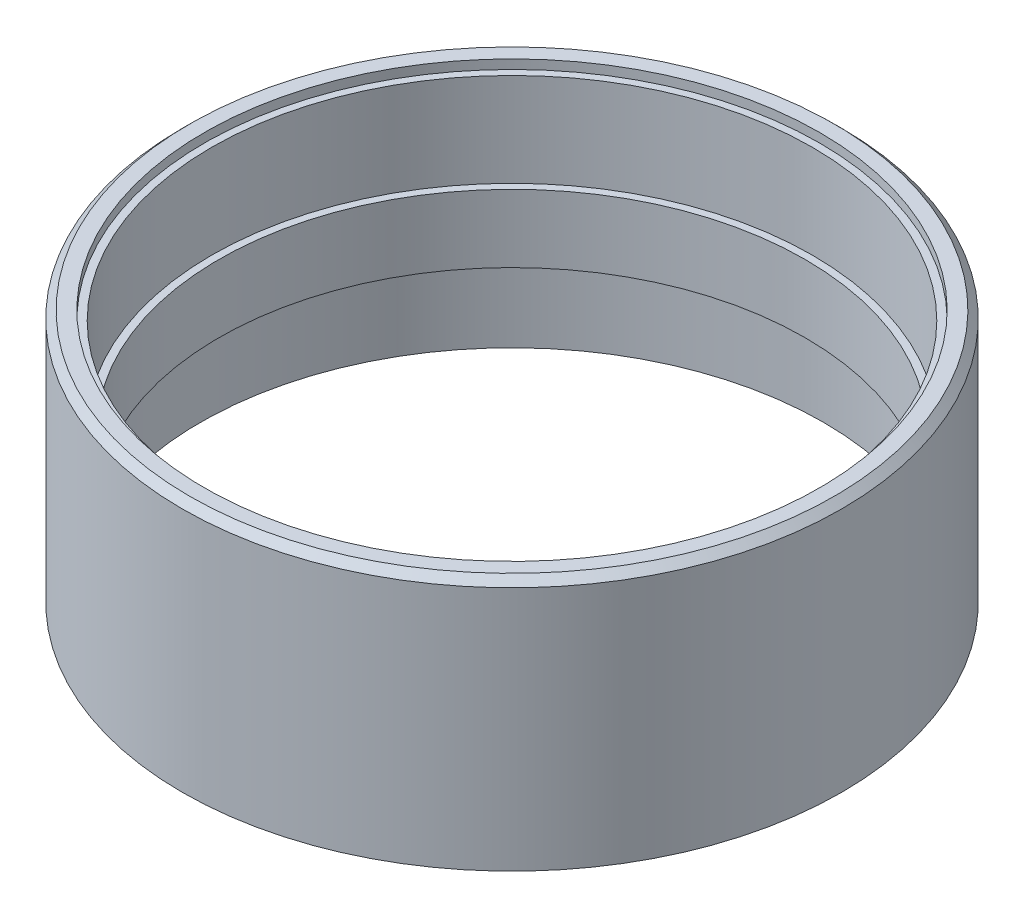
ISO-10303-21;
HEADER;
FILE_DESCRIPTION(('STEP AP214'),'2;1');
FILE_NAME('part.step','',(''),(''),'','','');
FILE_SCHEMA(('AUTOMOTIVE_DESIGN { 1 0 10303 214 1 1 1 1 }'));
ENDSEC;
DATA;
#1=APPLICATION_CONTEXT('core data for automotive mechanical design processes');
#2=APPLICATION_PROTOCOL_DEFINITION('international standard','automotive_design',2000,#1);
#3=PRODUCT_CONTEXT('',#1,'mechanical');
#4=PRODUCT('Part','Part','',(#3));
#5=PRODUCT_RELATED_PRODUCT_CATEGORY('part','',(#4));
#6=PRODUCT_DEFINITION_FORMATION('','',#4);
#7=PRODUCT_DEFINITION_CONTEXT('part definition',#1,'design');
#8=PRODUCT_DEFINITION('design','',#6,#7);
#9=PRODUCT_DEFINITION_SHAPE('','',#8);
#10=(LENGTH_UNIT() NAMED_UNIT(*) SI_UNIT(.MILLI.,.METRE.));
#11=(NAMED_UNIT(*) PLANE_ANGLE_UNIT() SI_UNIT($,.RADIAN.));
#12=(NAMED_UNIT(*) SI_UNIT($,.STERADIAN.) SOLID_ANGLE_UNIT());
#13=UNCERTAINTY_MEASURE_WITH_UNIT(LENGTH_MEASURE(1.E-05),#10,'distance_accuracy_value','');
#14=(GEOMETRIC_REPRESENTATION_CONTEXT(3) GLOBAL_UNCERTAINTY_ASSIGNED_CONTEXT((#13)) GLOBAL_UNIT_ASSIGNED_CONTEXT((#10,
#11,#12)) REPRESENTATION_CONTEXT('',''));
#15=CARTESIAN_POINT('',(0.,0.,0.));
#16=DIRECTION('',(0.,0.,1.));
#17=DIRECTION('',(1.,0.,0.));
#18=AXIS2_PLACEMENT_3D('',#15,#16,#17);
#19=CARTESIAN_POINT('',(22.86,17.526,0.));
#20=DIRECTION('',(0.,1.,0.));
#21=DIRECTION('',(0.,0.,1.));
#22=AXIS2_PLACEMENT_3D('',#19,#20,#21);
#23=PLANE('',#22);
#24=CARTESIAN_POINT('',(0.,17.526,0.));
#25=DIRECTION('',(0.,1.,0.));
#26=DIRECTION('',(0.,0.,1.));
#27=AXIS2_PLACEMENT_3D('',#24,#25,#26);
#28=CIRCLE('',#27,22.352);
#29=CARTESIAN_POINT('',(0.,17.526,22.352));
#30=VERTEX_POINT('',#29);
#31=EDGE_CURVE('E11',#30,#30,#28,.T.);
#32=ORIENTED_EDGE('',*,*,#31,.T.);
#33=EDGE_LOOP('',(#32));
#34=FACE_BOUND('',#33,.T.);
#35=CARTESIAN_POINT('',(0.,17.526,0.));
#36=DIRECTION('',(0.,-1.,0.));
#37=DIRECTION('',(0.,0.,-1.));
#38=AXIS2_PLACEMENT_3D('',#35,#36,#37);
#39=CIRCLE('',#38,21.336);
#40=CARTESIAN_POINT('',(0.,17.526,-21.336));
#41=VERTEX_POINT('',#40);
#42=EDGE_CURVE('E72',#41,#41,#39,.T.);
#43=ORIENTED_EDGE('',*,*,#42,.T.);
#44=EDGE_LOOP('',(#43));
#45=FACE_BOUND('',#44,.T.);
#46=ADVANCED_FACE('F37',(#34,#45),#23,.T.);
#47=CARTESIAN_POINT('',(0.,-7.74131889682308,0.));
#48=DIRECTION('',(0.,-1.,0.));
#49=DIRECTION('',(0.,0.,-1.));
#50=AXIS2_PLACEMENT_3D('',#47,#48,#49);
#51=CYLINDRICAL_SURFACE('',#50,22.86);
#52=CARTESIAN_POINT('',(0.,17.018,0.));
#53=DIRECTION('',(0.,1.,0.));
#54=DIRECTION('',(0.,0.,1.));
#55=AXIS2_PLACEMENT_3D('',#52,#53,#54);
#56=CIRCLE('',#55,22.86);
#57=CARTESIAN_POINT('',(0.,17.018,22.86));
#58=VERTEX_POINT('',#57);
#59=EDGE_CURVE('E44',#58,#58,#56,.F.);
#60=ORIENTED_EDGE('',*,*,#59,.T.);
#61=EDGE_LOOP('',(#60));
#62=FACE_BOUND('',#61,.T.);
#63=CARTESIAN_POINT('',(0.,0.,0.));
#64=DIRECTION('',(0.,-1.,0.));
#65=DIRECTION('',(0.,0.,-1.));
#66=AXIS2_PLACEMENT_3D('',#63,#64,#65);
#67=CIRCLE('',#66,22.86);
#68=CARTESIAN_POINT('',(0.,0.,-22.86));
#69=VERTEX_POINT('',#68);
#70=EDGE_CURVE('E48',#69,#69,#67,.T.);
#71=ORIENTED_EDGE('',*,*,#70,.F.);
#72=EDGE_LOOP('',(#71));
#73=FACE_BOUND('',#72,.T.);
#74=ADVANCED_FACE('F83',(#62,#73),#51,.T.);
#75=CARTESIAN_POINT('',(22.225,0.,0.));
#76=DIRECTION('',(0.,-1.,0.));
#77=DIRECTION('',(0.,0.,-1.));
#78=AXIS2_PLACEMENT_3D('',#75,#76,#77);
#79=PLANE('',#78);
#80=ORIENTED_EDGE('',*,*,#70,.T.);
#81=EDGE_LOOP('',(#80));
#82=FACE_BOUND('',#81,.T.);
#83=CARTESIAN_POINT('',(0.,0.,0.));
#84=DIRECTION('',(0.,-1.,0.));
#85=DIRECTION('',(0.,0.,-1.));
#86=AXIS2_PLACEMENT_3D('',#83,#84,#85);
#87=CIRCLE('',#86,21.59);
#88=CARTESIAN_POINT('',(0.,0.,-21.59));
#89=VERTEX_POINT('',#88);
#90=EDGE_CURVE('E75',#89,#89,#87,.T.);
#91=ORIENTED_EDGE('',*,*,#90,.F.);
#92=EDGE_LOOP('',(#91));
#93=FACE_BOUND('',#92,.T.);
#94=ADVANCED_FACE('F81',(#82,#93),#79,.T.);
#95=CARTESIAN_POINT('',(0.,-7.74131889682308,0.));
#96=DIRECTION('',(0.,-1.,0.));
#97=DIRECTION('',(0.,0.,-1.));
#98=AXIS2_PLACEMENT_3D('',#95,#96,#97);
#99=CYLINDRICAL_SURFACE('',#98,21.59);
#100=CARTESIAN_POINT('',(0.,5.715,0.));
#101=DIRECTION('',(0.,-1.,0.));
#102=DIRECTION('',(0.,0.,-1.));
#103=AXIS2_PLACEMENT_3D('',#100,#101,#102);
#104=CIRCLE('',#103,21.59);
#105=CARTESIAN_POINT('',(0.,5.715,-21.59));
#106=VERTEX_POINT('',#105);
#107=EDGE_CURVE('E52',#106,#106,#104,.T.);
#108=ORIENTED_EDGE('',*,*,#107,.F.);
#109=EDGE_LOOP('',(#108));
#110=FACE_BOUND('',#109,.T.);
#111=ORIENTED_EDGE('',*,*,#90,.T.);
#112=EDGE_LOOP('',(#111));
#113=FACE_BOUND('',#112,.T.);
#114=ADVANCED_FACE('F79',(#110,#113),#99,.F.);
#115=CARTESIAN_POINT('',(20.32,5.715,0.));
#116=DIRECTION('',(0.,-1.,0.));
#117=DIRECTION('',(0.,0.,-1.));
#118=AXIS2_PLACEMENT_3D('',#115,#116,#117);
#119=PLANE('',#118);
#120=ORIENTED_EDGE('',*,*,#107,.T.);
#121=EDGE_LOOP('',(#120));
#122=FACE_BOUND('',#121,.T.);
#123=CARTESIAN_POINT('',(0.,5.715,0.));
#124=DIRECTION('',(0.,-1.,0.));
#125=DIRECTION('',(0.,0.,-1.));
#126=AXIS2_PLACEMENT_3D('',#123,#124,#125);
#127=CIRCLE('',#126,20.32);
#128=CARTESIAN_POINT('',(0.,5.715,-20.32));
#129=VERTEX_POINT('',#128);
#130=EDGE_CURVE('E57',#129,#129,#127,.T.);
#131=ORIENTED_EDGE('',*,*,#130,.F.);
#132=EDGE_LOOP('',(#131));
#133=FACE_BOUND('',#132,.T.);
#134=ADVANCED_FACE('F90',(#122,#133),#119,.T.);
#135=CARTESIAN_POINT('',(0.,-7.74131889682308,0.));
#136=DIRECTION('',(0.,-1.,0.));
#137=DIRECTION('',(0.,0.,-1.));
#138=AXIS2_PLACEMENT_3D('',#135,#136,#137);
#139=CYLINDRICAL_SURFACE('',#138,20.32);
#140=ORIENTED_EDGE('',*,*,#130,.T.);
#141=EDGE_LOOP('',(#140));
#142=FACE_BOUND('',#141,.T.);
#143=CARTESIAN_POINT('',(0.,10.414,0.));
#144=DIRECTION('',(0.,-1.,0.));
#145=DIRECTION('',(0.,0.,-1.));
#146=AXIS2_PLACEMENT_3D('',#143,#144,#145);
#147=CIRCLE('',#146,20.32);
#148=CARTESIAN_POINT('',(0.,10.414,-20.32));
#149=VERTEX_POINT('',#148);
#150=EDGE_CURVE('E60',#149,#149,#147,.T.);
#151=ORIENTED_EDGE('',*,*,#150,.F.);
#152=EDGE_LOOP('',(#151));
#153=FACE_BOUND('',#152,.T.);
#154=ADVANCED_FACE('F120',(#142,#153),#139,.F.);
#155=CARTESIAN_POINT('',(20.828,10.414,0.));
#156=DIRECTION('',(0.,1.,0.));
#157=DIRECTION('',(0.,0.,1.));
#158=AXIS2_PLACEMENT_3D('',#155,#156,#157);
#159=PLANE('',#158);
#160=ORIENTED_EDGE('',*,*,#150,.T.);
#161=EDGE_LOOP('',(#160));
#162=FACE_BOUND('',#161,.T.);
#163=CARTESIAN_POINT('',(0.,10.414,0.));
#164=DIRECTION('',(0.,-1.,0.));
#165=DIRECTION('',(0.,0.,-1.));
#166=AXIS2_PLACEMENT_3D('',#163,#164,#165);
#167=CIRCLE('',#166,20.828);
#168=CARTESIAN_POINT('',(0.,10.414,-20.828));
#169=VERTEX_POINT('',#168);
#170=EDGE_CURVE('E63',#169,#169,#167,.T.);
#171=ORIENTED_EDGE('',*,*,#170,.F.);
#172=EDGE_LOOP('',(#171));
#173=FACE_BOUND('',#172,.T.);
#174=ADVANCED_FACE('F116',(#162,#173),#159,.T.);
#175=CARTESIAN_POINT('',(0.,-7.74131889682308,0.));
#176=DIRECTION('',(0.,-1.,0.));
#177=DIRECTION('',(0.,0.,-1.));
#178=AXIS2_PLACEMENT_3D('',#175,#176,#177);
#179=CYLINDRICAL_SURFACE('',#178,20.828);
#180=ORIENTED_EDGE('',*,*,#170,.T.);
#181=EDGE_LOOP('',(#180));
#182=FACE_BOUND('',#181,.T.);
#183=CARTESIAN_POINT('',(0.,16.891,0.));
#184=DIRECTION('',(0.,-1.,0.));
#185=DIRECTION('',(0.,0.,-1.));
#186=AXIS2_PLACEMENT_3D('',#183,#184,#185);
#187=CIRCLE('',#186,20.828);
#188=CARTESIAN_POINT('',(0.,16.891,-20.828));
#189=VERTEX_POINT('',#188);
#190=EDGE_CURVE('E66',#189,#189,#187,.T.);
#191=ORIENTED_EDGE('',*,*,#190,.F.);
#192=EDGE_LOOP('',(#191));
#193=FACE_BOUND('',#192,.T.);
#194=ADVANCED_FACE('F110',(#182,#193),#179,.F.);
#195=CARTESIAN_POINT('',(21.336,16.891,0.));
#196=DIRECTION('',(0.,1.,0.));
#197=DIRECTION('',(0.,0.,1.));
#198=AXIS2_PLACEMENT_3D('',#195,#196,#197);
#199=PLANE('',#198);
#200=ORIENTED_EDGE('',*,*,#190,.T.);
#201=EDGE_LOOP('',(#200));
#202=FACE_BOUND('',#201,.T.);
#203=CARTESIAN_POINT('',(0.,16.891,0.));
#204=DIRECTION('',(0.,-1.,0.));
#205=DIRECTION('',(0.,0.,-1.));
#206=AXIS2_PLACEMENT_3D('',#203,#204,#205);
#207=CIRCLE('',#206,21.336);
#208=CARTESIAN_POINT('',(0.,16.891,-21.336));
#209=VERTEX_POINT('',#208);
#210=EDGE_CURVE('E69',#209,#209,#207,.T.);
#211=ORIENTED_EDGE('',*,*,#210,.F.);
#212=EDGE_LOOP('',(#211));
#213=FACE_BOUND('',#212,.T.);
#214=ADVANCED_FACE('F102',(#202,#213),#199,.T.);
#215=CARTESIAN_POINT('',(0.,-7.74131889682308,0.));
#216=DIRECTION('',(0.,-1.,0.));
#217=DIRECTION('',(0.,0.,-1.));
#218=AXIS2_PLACEMENT_3D('',#215,#216,#217);
#219=CYLINDRICAL_SURFACE('',#218,21.336);
#220=ORIENTED_EDGE('',*,*,#210,.T.);
#221=EDGE_LOOP('',(#220));
#222=FACE_BOUND('',#221,.T.);
#223=ORIENTED_EDGE('',*,*,#42,.F.);
#224=EDGE_LOOP('',(#223));
#225=FACE_BOUND('',#224,.T.);
#226=ADVANCED_FACE('F100',(#222,#225),#219,.F.);
#227=CARTESIAN_POINT('',(0.,17.018,0.));
#228=DIRECTION('',(0.,-1.,0.));
#229=DIRECTION('',(0.,0.,-1.));
#230=AXIS2_PLACEMENT_3D('',#227,#228,#229);
#231=CONICAL_SURFACE('',#230,22.86,0.785398163397455);
#232=ORIENTED_EDGE('',*,*,#31,.F.);
#233=EDGE_LOOP('',(#232));
#234=FACE_BOUND('',#233,.T.);
#235=ORIENTED_EDGE('',*,*,#59,.F.);
#236=EDGE_LOOP('',(#235));
#237=FACE_BOUND('',#236,.T.);
#238=ADVANCED_FACE('F39',(#234,#237),#231,.T.);
#239=CLOSED_SHELL('',(#46,#74,#94,#114,#134,#154,#174,#194,#214,#226,#238));
#240=MANIFOLD_SOLID_BREP('B2',#239);
#241=ADVANCED_BREP_SHAPE_REPRESENTATION('',(#18,#240),#14);
#242=SHAPE_DEFINITION_REPRESENTATION(#9,#241);
ENDSEC;
END-ISO-10303-21;
